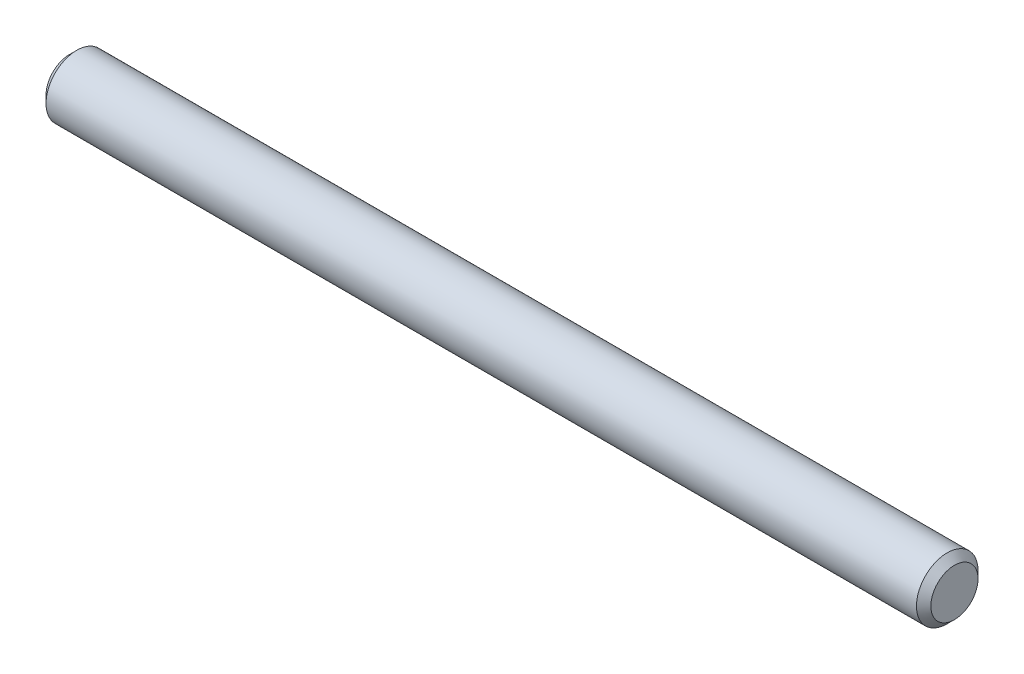
ISO-10303-21;
HEADER;
FILE_DESCRIPTION(('STEP AP214'),'2;1');
FILE_NAME('part.step','',(''),(''),'','','');
FILE_SCHEMA(('AUTOMOTIVE_DESIGN { 1 0 10303 214 1 1 1 1 }'));
ENDSEC;
DATA;
#1=APPLICATION_CONTEXT('core data for automotive mechanical design processes');
#2=APPLICATION_PROTOCOL_DEFINITION('international standard','automotive_design',2000,#1);
#3=PRODUCT_CONTEXT('',#1,'mechanical');
#4=PRODUCT('Part','Part','',(#3));
#5=PRODUCT_RELATED_PRODUCT_CATEGORY('part','',(#4));
#6=PRODUCT_DEFINITION_FORMATION('','',#4);
#7=PRODUCT_DEFINITION_CONTEXT('part definition',#1,'design');
#8=PRODUCT_DEFINITION('design','',#6,#7);
#9=PRODUCT_DEFINITION_SHAPE('','',#8);
#10=(LENGTH_UNIT() NAMED_UNIT(*) SI_UNIT(.MILLI.,.METRE.));
#11=(NAMED_UNIT(*) PLANE_ANGLE_UNIT() SI_UNIT($,.RADIAN.));
#12=(NAMED_UNIT(*) SI_UNIT($,.STERADIAN.) SOLID_ANGLE_UNIT());
#13=UNCERTAINTY_MEASURE_WITH_UNIT(LENGTH_MEASURE(1.E-05),#10,'distance_accuracy_value','');
#14=(GEOMETRIC_REPRESENTATION_CONTEXT(3) GLOBAL_UNCERTAINTY_ASSIGNED_CONTEXT((#13)) GLOBAL_UNIT_ASSIGNED_CONTEXT((#10,
#11,#12)) REPRESENTATION_CONTEXT('',''));
#15=CARTESIAN_POINT('',(0.,0.,0.));
#16=DIRECTION('',(0.,0.,1.));
#17=DIRECTION('',(1.,0.,0.));
#18=AXIS2_PLACEMENT_3D('',#15,#16,#17);
#19=CARTESIAN_POINT('',(-57.5,0.,0.));
#20=DIRECTION('',(1.,0.,0.));
#21=DIRECTION('',(0.,0.,-1.));
#22=AXIS2_PLACEMENT_3D('',#19,#20,#21);
#23=CYLINDRICAL_SURFACE('',#22,4.);
#24=CARTESIAN_POINT('',(-56.5625,0.,0.));
#25=DIRECTION('',(1.,0.,0.));
#26=DIRECTION('',(0.,0.,-1.));
#27=AXIS2_PLACEMENT_3D('',#24,#25,#26);
#28=CIRCLE('',#27,4.);
#29=CARTESIAN_POINT('',(-56.5625,0.,-4.));
#30=VERTEX_POINT('',#29);
#31=EDGE_CURVE('E43',#30,#30,#28,.T.);
#32=ORIENTED_EDGE('',*,*,#31,.T.);
#33=EDGE_LOOP('',(#32));
#34=FACE_BOUND('',#33,.T.);
#35=CARTESIAN_POINT('',(56.5625,0.,0.));
#36=DIRECTION('',(1.,0.,0.));
#37=DIRECTION('',(0.,0.,-1.));
#38=AXIS2_PLACEMENT_3D('',#35,#36,#37);
#39=CIRCLE('',#38,4.);
#40=CARTESIAN_POINT('',(56.5625,0.,-4.));
#41=VERTEX_POINT('',#40);
#42=EDGE_CURVE('E47',#41,#41,#39,.F.);
#43=ORIENTED_EDGE('',*,*,#42,.T.);
#44=EDGE_LOOP('',(#43));
#45=FACE_BOUND('',#44,.T.);
#46=ADVANCED_FACE('F32',(#34,#45),#23,.T.);
#47=CARTESIAN_POINT('',(-57.5,0.,0.));
#48=DIRECTION('',(1.,0.,0.));
#49=DIRECTION('',(0.,0.,-1.));
#50=AXIS2_PLACEMENT_3D('',#47,#48,#49);
#51=PLANE('',#50);
#52=CARTESIAN_POINT('',(-57.5,0.,0.));
#53=DIRECTION('',(1.,0.,0.));
#54=DIRECTION('',(0.,0.,-1.));
#55=AXIS2_PLACEMENT_3D('',#52,#53,#54);
#56=CIRCLE('',#55,3.0625);
#57=CARTESIAN_POINT('',(-57.5,0.,-3.0625));
#58=VERTEX_POINT('',#57);
#59=EDGE_CURVE('E39',#58,#58,#56,.F.);
#60=ORIENTED_EDGE('',*,*,#59,.T.);
#61=EDGE_LOOP('',(#60));
#62=FACE_BOUND('',#61,.T.);
#63=ADVANCED_FACE('F63',(#62),#51,.F.);
#64=CARTESIAN_POINT('',(57.5,0.,0.));
#65=DIRECTION('',(1.,0.,0.));
#66=DIRECTION('',(0.,0.,-1.));
#67=AXIS2_PLACEMENT_3D('',#64,#65,#66);
#68=PLANE('',#67);
#69=CARTESIAN_POINT('',(57.5,0.,0.));
#70=DIRECTION('',(1.,0.,0.));
#71=DIRECTION('',(0.,0.,-1.));
#72=AXIS2_PLACEMENT_3D('',#69,#70,#71);
#73=CIRCLE('',#72,3.06250000000001);
#74=CARTESIAN_POINT('',(57.5,0.,-3.06250000000001));
#75=VERTEX_POINT('',#74);
#76=EDGE_CURVE('E10',#75,#75,#73,.T.);
#77=ORIENTED_EDGE('',*,*,#76,.T.);
#78=EDGE_LOOP('',(#77));
#79=FACE_BOUND('',#78,.T.);
#80=ADVANCED_FACE('F60',(#79),#68,.T.);
#81=CARTESIAN_POINT('',(-56.5625,0.,0.));
#82=DIRECTION('',(1.,0.,0.));
#83=DIRECTION('',(0.,0.,-1.));
#84=AXIS2_PLACEMENT_3D('',#81,#82,#83);
#85=CONICAL_SURFACE('',#84,4.,0.785398163397447);
#86=ORIENTED_EDGE('',*,*,#59,.F.);
#87=EDGE_LOOP('',(#86));
#88=FACE_BOUND('',#87,.T.);
#89=ORIENTED_EDGE('',*,*,#31,.F.);
#90=EDGE_LOOP('',(#89));
#91=FACE_BOUND('',#90,.T.);
#92=ADVANCED_FACE('F56',(#88,#91),#85,.T.);
#93=CARTESIAN_POINT('',(57.5,0.,0.));
#94=DIRECTION('',(-1.,0.,0.));
#95=DIRECTION('',(0.,0.,1.));
#96=AXIS2_PLACEMENT_3D('',#93,#94,#95);
#97=CONICAL_SURFACE('',#96,3.06250000000001,0.785398163397446);
#98=ORIENTED_EDGE('',*,*,#42,.F.);
#99=EDGE_LOOP('',(#98));
#100=FACE_BOUND('',#99,.T.);
#101=ORIENTED_EDGE('',*,*,#76,.F.);
#102=EDGE_LOOP('',(#101));
#103=FACE_BOUND('',#102,.T.);
#104=ADVANCED_FACE('F34',(#100,#103),#97,.T.);
#105=CLOSED_SHELL('',(#46,#63,#80,#92,#104));
#106=MANIFOLD_SOLID_BREP('B2',#105);
#107=ADVANCED_BREP_SHAPE_REPRESENTATION('',(#18,#106),#14);
#108=SHAPE_DEFINITION_REPRESENTATION(#9,#107);
ENDSEC;
END-ISO-10303-21;
